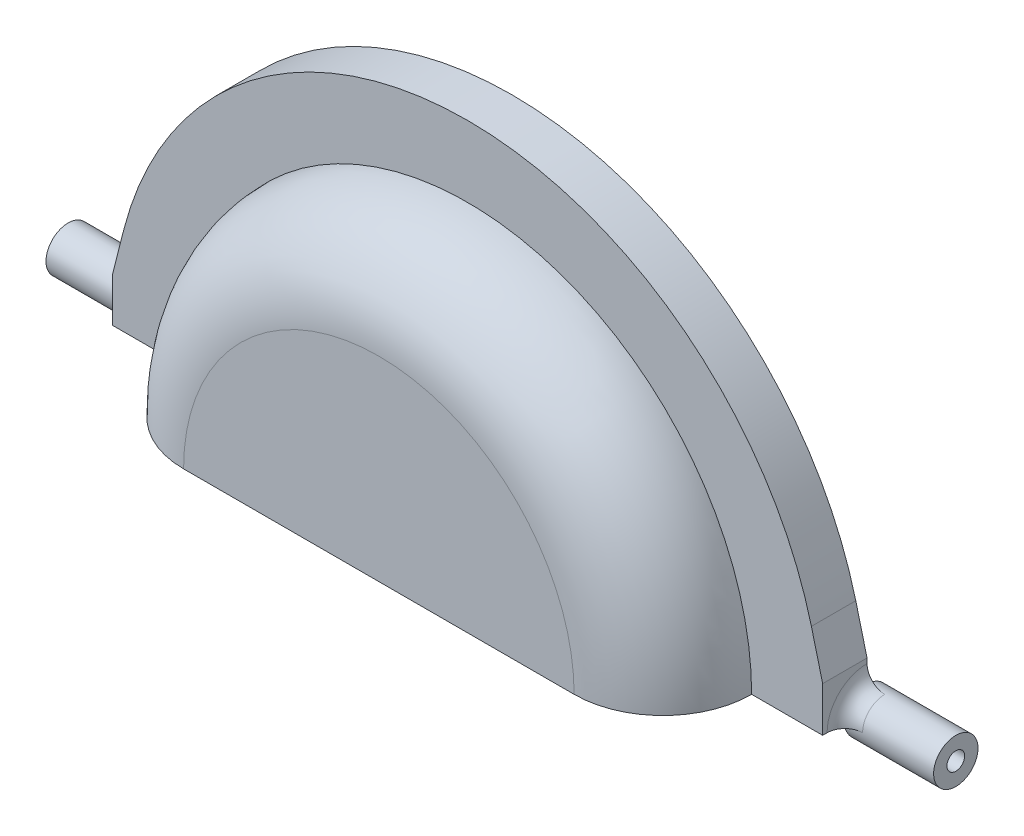
ISO-10303-21;
HEADER;
FILE_DESCRIPTION(('STEP AP214'),'2;1');
FILE_NAME('part.step','',(''),(''),'','','');
FILE_SCHEMA(('AUTOMOTIVE_DESIGN { 1 0 10303 214 1 1 1 1 }'));
ENDSEC;
DATA;
#1=APPLICATION_CONTEXT('core data for automotive mechanical design processes');
#2=APPLICATION_PROTOCOL_DEFINITION('international standard','automotive_design',2000,#1);
#3=PRODUCT_CONTEXT('',#1,'mechanical');
#4=PRODUCT('Part','Part','',(#3));
#5=PRODUCT_RELATED_PRODUCT_CATEGORY('part','',(#4));
#6=PRODUCT_DEFINITION_FORMATION('','',#4);
#7=PRODUCT_DEFINITION_CONTEXT('part definition',#1,'design');
#8=PRODUCT_DEFINITION('design','',#6,#7);
#9=PRODUCT_DEFINITION_SHAPE('','',#8);
#10=(LENGTH_UNIT() NAMED_UNIT(*) SI_UNIT(.MILLI.,.METRE.));
#11=(NAMED_UNIT(*) PLANE_ANGLE_UNIT() SI_UNIT($,.RADIAN.));
#12=(NAMED_UNIT(*) SI_UNIT($,.STERADIAN.) SOLID_ANGLE_UNIT());
#13=UNCERTAINTY_MEASURE_WITH_UNIT(LENGTH_MEASURE(1.E-05),#10,'distance_accuracy_value','');
#14=(GEOMETRIC_REPRESENTATION_CONTEXT(3) GLOBAL_UNCERTAINTY_ASSIGNED_CONTEXT((#13)) GLOBAL_UNIT_ASSIGNED_CONTEXT((#10,
#11,#12)) REPRESENTATION_CONTEXT('',''));
#15=CARTESIAN_POINT('',(0.,0.,0.));
#16=DIRECTION('',(0.,0.,1.));
#17=DIRECTION('',(1.,0.,0.));
#18=AXIS2_PLACEMENT_3D('',#15,#16,#17);
#19=CARTESIAN_POINT('',(0.,0.,5.));
#20=DIRECTION('',(0.,0.,-1.));
#21=DIRECTION('',(-1.,0.,0.));
#22=AXIS2_PLACEMENT_3D('',#19,#20,#21);
#23=PLANE('',#22);
#24=DIRECTION('',(0.248542922989455,-0.968620883231339,0.));
#25=VECTOR('',#24,1.);
#26=CARTESIAN_POINT('',(38.7447914752641,9.94170566687973,5.));
#27=LINE('',#26,#25);
#28=CARTESIAN_POINT('',(38.7298334620742,10.,5.));
#29=VERTEX_POINT('',#28);
#30=CARTESIAN_POINT('',(40.,5.04991001546718,5.));
#31=VERTEX_POINT('',#30);
#32=EDGE_CURVE('E299',#29,#31,#27,.T.);
#33=ORIENTED_EDGE('',*,*,#32,.F.);
#34=CARTESIAN_POINT('',(0.,0.,5.));
#35=DIRECTION('',(0.,0.,-1.));
#36=DIRECTION('',(-1.,0.,0.));
#37=AXIS2_PLACEMENT_3D('',#34,#35,#36);
#38=CIRCLE('',#37,40.);
#39=CARTESIAN_POINT('',(-38.7298334620742,10.,5.));
#40=VERTEX_POINT('',#39);
#41=EDGE_CURVE('E343',#40,#29,#38,.T.);
#42=ORIENTED_EDGE('',*,*,#41,.F.);
#43=DIRECTION('',(-0.246213076315086,-0.969215724723584,0.));
#44=VECTOR('',#43,1.);
#45=CARTESIAN_POINT('',(-38.7683327680442,9.84844780262866,5.));
#46=LINE('',#45,#44);
#47=CARTESIAN_POINT('',(-40.,5.,5.));
#48=VERTEX_POINT('',#47);
#49=EDGE_CURVE('E313',#40,#48,#46,.T.);
#50=ORIENTED_EDGE('',*,*,#49,.T.);
#51=DIRECTION('',(0.,1.,0.));
#52=VECTOR('',#51,1.);
#53=CARTESIAN_POINT('',(-40.,-5.,5.));
#54=LINE('',#53,#52);
#55=CARTESIAN_POINT('',(-40.,0.,5.));
#56=VERTEX_POINT('',#55);
#57=EDGE_CURVE('E353',#56,#48,#54,.T.);
#58=ORIENTED_EDGE('',*,*,#57,.F.);
#59=DIRECTION('',(-1.,0.,0.));
#60=VECTOR('',#59,1.);
#61=CARTESIAN_POINT('',(0.,0.,5.));
#62=LINE('',#61,#60);
#63=CARTESIAN_POINT('',(-32.,0.,5.));
#64=VERTEX_POINT('',#63);
#65=EDGE_CURVE('E370',#64,#56,#62,.T.);
#66=ORIENTED_EDGE('',*,*,#65,.F.);
#67=CARTESIAN_POINT('',(0.,0.,5.));
#68=DIRECTION('',(0.,0.,1.));
#69=DIRECTION('',(1.,0.,0.));
#70=AXIS2_PLACEMENT_3D('',#67,#68,#69);
#71=CIRCLE('',#70,32.);
#72=CARTESIAN_POINT('',(32.,0.,5.));
#73=VERTEX_POINT('',#72);
#74=EDGE_CURVE('E357',#64,#73,#71,.F.);
#75=ORIENTED_EDGE('',*,*,#74,.T.);
#76=CARTESIAN_POINT('',(40.,0.,5.));
#77=VERTEX_POINT('',#76);
#78=EDGE_CURVE('E367',#77,#73,#62,.T.);
#79=ORIENTED_EDGE('',*,*,#78,.F.);
#80=DIRECTION('',(0.,1.,0.));
#81=VECTOR('',#80,1.);
#82=CARTESIAN_POINT('',(40.,-4.95008998453282,5.));
#83=LINE('',#82,#81);
#84=EDGE_CURVE('E291',#77,#31,#83,.T.);
#85=ORIENTED_EDGE('',*,*,#84,.T.);
#86=EDGE_LOOP('',(#33,#42,#50,#58,#66,#75,#79,#85));
#87=FACE_BOUND('',#86,.T.);
#88=ADVANCED_FACE('F118',(#87),#23,.F.);
#89=CARTESIAN_POINT('',(0.,0.,0.));
#90=DIRECTION('',(0.,0.,1.));
#91=DIRECTION('',(1.,0.,0.));
#92=AXIS2_PLACEMENT_3D('',#89,#90,#91);
#93=PLANE('',#92);
#94=DIRECTION('',(0.248542922989455,-0.968620883231338,0.));
#95=VECTOR('',#94,1.);
#96=CARTESIAN_POINT('',(38.7298334620742,10.,0.));
#97=LINE('',#96,#95);
#98=CARTESIAN_POINT('',(38.7298334620742,10.,0.));
#99=VERTEX_POINT('',#98);
#100=CARTESIAN_POINT('',(40.,5.04991001546718,0.));
#101=VERTEX_POINT('',#100);
#102=EDGE_CURVE('E296',#99,#101,#97,.T.);
#103=ORIENTED_EDGE('',*,*,#102,.T.);
#104=DIRECTION('',(0.,1.,0.));
#105=VECTOR('',#104,1.);
#106=CARTESIAN_POINT('',(40.,-4.95008998453282,0.));
#107=LINE('',#106,#105);
#108=CARTESIAN_POINT('',(40.,4.5,0.));
#109=VERTEX_POINT('',#108);
#110=EDGE_CURVE('E279',#109,#101,#107,.T.);
#111=ORIENTED_EDGE('',*,*,#110,.F.);
#112=CARTESIAN_POINT('',(42.,4.5,0.));
#113=DIRECTION('',(0.,0.,1.));
#114=DIRECTION('',(1.,0.,0.));
#115=AXIS2_PLACEMENT_3D('',#112,#113,#114);
#116=CIRCLE('',#115,2.);
#117=CARTESIAN_POINT('',(42.,2.5,0.));
#118=VERTEX_POINT('',#117);
#119=EDGE_CURVE('E438',#109,#118,#116,.T.);
#120=ORIENTED_EDGE('',*,*,#119,.T.);
#121=DIRECTION('',(-1.,0.,0.));
#122=VECTOR('',#121,1.);
#123=CARTESIAN_POINT('',(40.,2.5,0.));
#124=LINE('',#123,#122);
#125=CARTESIAN_POINT('',(40.,2.5,0.));
#126=VERTEX_POINT('',#125);
#127=EDGE_CURVE('E417',#126,#118,#124,.F.);
#128=ORIENTED_EDGE('',*,*,#127,.F.);
#129=CARTESIAN_POINT('',(40.,1.,0.));
#130=VERTEX_POINT('',#129);
#131=EDGE_CURVE('E290',#130,#126,#107,.T.);
#132=ORIENTED_EDGE('',*,*,#131,.F.);
#133=CARTESIAN_POINT('',(40.,0.,0.));
#134=VERTEX_POINT('',#133);
#135=EDGE_CURVE('E293',#134,#130,#107,.T.);
#136=ORIENTED_EDGE('',*,*,#135,.F.);
#137=DIRECTION('',(1.,0.,0.));
#138=VECTOR('',#137,1.);
#139=CARTESIAN_POINT('',(0.,0.,0.));
#140=LINE('',#139,#138);
#141=CARTESIAN_POINT('',(29.,0.,0.));
#142=VERTEX_POINT('',#141);
#143=EDGE_CURVE('E378',#142,#134,#140,.T.);
#144=ORIENTED_EDGE('',*,*,#143,.F.);
#145=CARTESIAN_POINT('',(0.,0.,0.));
#146=DIRECTION('',(0.,0.,-1.));
#147=DIRECTION('',(-1.,0.,0.));
#148=AXIS2_PLACEMENT_3D('',#145,#146,#147);
#149=CIRCLE('',#148,29.);
#150=CARTESIAN_POINT('',(-29.,0.,0.));
#151=VERTEX_POINT('',#150);
#152=EDGE_CURVE('E415',#151,#142,#149,.T.);
#153=ORIENTED_EDGE('',*,*,#152,.F.);
#154=CARTESIAN_POINT('',(-40.,0.,0.));
#155=VERTEX_POINT('',#154);
#156=EDGE_CURVE('E375',#155,#151,#140,.T.);
#157=ORIENTED_EDGE('',*,*,#156,.F.);
#158=DIRECTION('',(0.,1.,0.));
#159=VECTOR('',#158,1.);
#160=CARTESIAN_POINT('',(-40.,-5.,0.));
#161=LINE('',#160,#159);
#162=CARTESIAN_POINT('',(-40.,1.,0.));
#163=VERTEX_POINT('',#162);
#164=EDGE_CURVE('E409',#155,#163,#161,.T.);
#165=ORIENTED_EDGE('',*,*,#164,.T.);
#166=CARTESIAN_POINT('',(-40.,2.5,0.));
#167=VERTEX_POINT('',#166);
#168=EDGE_CURVE('E413',#163,#167,#161,.T.);
#169=ORIENTED_EDGE('',*,*,#168,.T.);
#170=DIRECTION('',(1.,0.,0.));
#171=VECTOR('',#170,1.);
#172=CARTESIAN_POINT('',(-42.,2.5,0.));
#173=LINE('',#172,#171);
#174=CARTESIAN_POINT('',(-42.,2.5,0.));
#175=VERTEX_POINT('',#174);
#176=EDGE_CURVE('E432',#175,#167,#173,.T.);
#177=ORIENTED_EDGE('',*,*,#176,.F.);
#178=CARTESIAN_POINT('',(-42.,4.5,0.));
#179=DIRECTION('',(0.,0.,1.));
#180=DIRECTION('',(1.,0.,0.));
#181=AXIS2_PLACEMENT_3D('',#178,#179,#180);
#182=CIRCLE('',#181,2.);
#183=CARTESIAN_POINT('',(-40.,4.5,0.));
#184=VERTEX_POINT('',#183);
#185=EDGE_CURVE('E440',#175,#184,#182,.T.);
#186=ORIENTED_EDGE('',*,*,#185,.T.);
#187=CARTESIAN_POINT('',(-40.,5.,0.));
#188=VERTEX_POINT('',#187);
#189=EDGE_CURVE('E408',#184,#188,#161,.T.);
#190=ORIENTED_EDGE('',*,*,#189,.T.);
#191=DIRECTION('',(-0.246213076315086,-0.969215724723584,0.));
#192=VECTOR('',#191,1.);
#193=CARTESIAN_POINT('',(-38.7298334620742,10.,0.));
#194=LINE('',#193,#192);
#195=CARTESIAN_POINT('',(-38.7298334620742,10.,0.));
#196=VERTEX_POINT('',#195);
#197=EDGE_CURVE('E308',#196,#188,#194,.T.);
#198=ORIENTED_EDGE('',*,*,#197,.F.);
#199=CARTESIAN_POINT('',(0.,0.,0.));
#200=DIRECTION('',(0.,0.,-1.));
#201=DIRECTION('',(-1.,0.,0.));
#202=AXIS2_PLACEMENT_3D('',#199,#200,#201);
#203=CIRCLE('',#202,40.);
#204=EDGE_CURVE('E301',#196,#99,#203,.T.);
#205=ORIENTED_EDGE('',*,*,#204,.T.);
#206=EDGE_LOOP('',(#103,#111,#120,#128,#132,#136,#144,#153,#157,#165,#169,#177,#186,#190,#198,#205));
#207=FACE_BOUND('',#206,.T.);
#208=ADVANCED_FACE('F304',(#207),#93,.F.);
#209=CARTESIAN_POINT('',(-40.,-5.,5.));
#210=DIRECTION('',(-1.,0.,0.));
#211=DIRECTION('',(0.,0.,1.));
#212=AXIS2_PLACEMENT_3D('',#209,#210,#211);
#213=PLANE('',#212);
#214=ORIENTED_EDGE('',*,*,#189,.F.);
#215=CARTESIAN_POINT('',(-40.,0.,0.));
#216=DIRECTION('',(-1.,0.,0.));
#217=DIRECTION('',(0.,0.,1.));
#218=AXIS2_PLACEMENT_3D('',#215,#216,#217);
#219=CIRCLE('',#218,4.5);
#220=CARTESIAN_POINT('',(-40.,0.,4.5));
#221=VERTEX_POINT('',#220);
#222=EDGE_CURVE('E434',#184,#221,#219,.F.);
#223=ORIENTED_EDGE('',*,*,#222,.T.);
#224=DIRECTION('',(0.,0.,1.));
#225=VECTOR('',#224,1.);
#226=CARTESIAN_POINT('',(-40.,0.,5.));
#227=LINE('',#226,#225);
#228=EDGE_CURVE('E358',#221,#56,#227,.T.);
#229=ORIENTED_EDGE('',*,*,#228,.T.);
#230=ORIENTED_EDGE('',*,*,#57,.T.);
#231=DIRECTION('',(0.,0.,-1.));
#232=VECTOR('',#231,1.);
#233=CARTESIAN_POINT('',(-40.,5.,5.));
#234=LINE('',#233,#232);
#235=EDGE_CURVE('E350',#48,#188,#234,.T.);
#236=ORIENTED_EDGE('',*,*,#235,.T.);
#237=EDGE_LOOP('',(#214,#223,#229,#230,#236));
#238=FACE_BOUND('',#237,.T.);
#239=ADVANCED_FACE('F498',(#238),#213,.T.);
#240=CARTESIAN_POINT('',(40.,-4.95008998453282,5.));
#241=DIRECTION('',(-1.,0.,0.));
#242=DIRECTION('',(0.,0.,1.));
#243=AXIS2_PLACEMENT_3D('',#240,#241,#242);
#244=PLANE('',#243);
#245=DIRECTION('',(0.,0.,1.));
#246=VECTOR('',#245,1.);
#247=CARTESIAN_POINT('',(40.,0.,5.));
#248=LINE('',#247,#246);
#249=CARTESIAN_POINT('',(40.,0.,4.5));
#250=VERTEX_POINT('',#249);
#251=EDGE_CURVE('E374',#250,#77,#248,.T.);
#252=ORIENTED_EDGE('',*,*,#251,.F.);
#253=CARTESIAN_POINT('',(40.,0.,0.));
#254=DIRECTION('',(-1.,0.,0.));
#255=DIRECTION('',(0.,0.,1.));
#256=AXIS2_PLACEMENT_3D('',#253,#254,#255);
#257=CIRCLE('',#256,4.5);
#258=EDGE_CURVE('E286',#250,#109,#257,.T.);
#259=ORIENTED_EDGE('',*,*,#258,.T.);
#260=ORIENTED_EDGE('',*,*,#110,.T.);
#261=DIRECTION('',(0.,0.,-1.));
#262=VECTOR('',#261,1.);
#263=CARTESIAN_POINT('',(40.,5.04991001546718,5.));
#264=LINE('',#263,#262);
#265=EDGE_CURVE('E284',#31,#101,#264,.T.);
#266=ORIENTED_EDGE('',*,*,#265,.F.);
#267=ORIENTED_EDGE('',*,*,#84,.F.);
#268=EDGE_LOOP('',(#252,#259,#260,#266,#267));
#269=FACE_BOUND('',#268,.T.);
#270=ADVANCED_FACE('F282',(#269),#244,.F.);
#271=CARTESIAN_POINT('',(60.,0.,15.01));
#272=DIRECTION('',(0.,-1.,0.));
#273=DIRECTION('',(0.,0.,-1.));
#274=AXIS2_PLACEMENT_3D('',#271,#272,#273);
#275=PLANE('',#274);
#276=DIRECTION('',(0.,0.,-1.));
#277=VECTOR('',#276,1.);
#278=CARTESIAN_POINT('',(-39.,0.,15.01));
#279=LINE('',#278,#277);
#280=CARTESIAN_POINT('',(-39.,0.,2.5));
#281=VERTEX_POINT('',#280);
#282=CARTESIAN_POINT('',(-39.,0.,1.));
#283=VERTEX_POINT('',#282);
#284=EDGE_CURVE('E549',#281,#283,#279,.T.);
#285=ORIENTED_EDGE('',*,*,#284,.T.);
#286=DIRECTION('',(1.,0.,0.));
#287=VECTOR('',#286,1.);
#288=CARTESIAN_POINT('',(-39.,0.,1.));
#289=LINE('',#288,#287);
#290=CARTESIAN_POINT('',(-40.,0.,1.));
#291=VERTEX_POINT('',#290);
#292=EDGE_CURVE('E551',#283,#291,#289,.F.);
#293=ORIENTED_EDGE('',*,*,#292,.T.);
#294=EDGE_CURVE('E354',#155,#291,#227,.T.);
#295=ORIENTED_EDGE('',*,*,#294,.F.);
#296=ORIENTED_EDGE('',*,*,#156,.T.);
#297=DIRECTION('',(0.,0.,-1.));
#298=VECTOR('',#297,1.);
#299=CARTESIAN_POINT('',(-29.,0.,5.));
#300=LINE('',#299,#298);
#301=CARTESIAN_POINT('',(-29.,0.,5.));
#302=VERTEX_POINT('',#301);
#303=EDGE_CURVE('E379',#151,#302,#300,.F.);
#304=ORIENTED_EDGE('',*,*,#303,.T.);
#305=DIRECTION('',(-1.,0.,0.));
#306=VECTOR('',#305,1.);
#307=CARTESIAN_POINT('',(0.,0.,5.));
#308=LINE('',#307,#306);
#309=CARTESIAN_POINT('',(-30.,0.,5.));
#310=VERTEX_POINT('',#309);
#311=EDGE_CURVE('E339',#302,#310,#308,.T.);
#312=ORIENTED_EDGE('',*,*,#311,.T.);
#313=CARTESIAN_POINT('',(-22.,0.,5.));
#314=DIRECTION('',(0.,-1.,0.));
#315=DIRECTION('',(0.,0.,-1.));
#316=AXIS2_PLACEMENT_3D('',#313,#314,#315);
#317=CIRCLE('',#316,8.);
#318=CARTESIAN_POINT('',(-22.,0.,13.));
#319=VERTEX_POINT('',#318);
#320=EDGE_CURVE('E391',#310,#319,#317,.F.);
#321=ORIENTED_EDGE('',*,*,#320,.T.);
#322=DIRECTION('',(1.,0.,0.));
#323=VECTOR('',#322,1.);
#324=CARTESIAN_POINT('',(0.,0.,13.));
#325=LINE('',#324,#323);
#326=CARTESIAN_POINT('',(22.,0.,13.));
#327=VERTEX_POINT('',#326);
#328=EDGE_CURVE('E385',#319,#327,#325,.T.);
#329=ORIENTED_EDGE('',*,*,#328,.T.);
#330=CARTESIAN_POINT('',(22.,0.,5.));
#331=DIRECTION('',(0.,-1.,0.));
#332=DIRECTION('',(0.,0.,-1.));
#333=AXIS2_PLACEMENT_3D('',#330,#331,#332);
#334=CIRCLE('',#333,8.);
#335=CARTESIAN_POINT('',(30.,0.,5.));
#336=VERTEX_POINT('',#335);
#337=EDGE_CURVE('E388',#327,#336,#334,.F.);
#338=ORIENTED_EDGE('',*,*,#337,.T.);
#339=CARTESIAN_POINT('',(29.,0.,5.));
#340=VERTEX_POINT('',#339);
#341=EDGE_CURVE('E394',#336,#340,#308,.T.);
#342=ORIENTED_EDGE('',*,*,#341,.T.);
#343=DIRECTION('',(0.,0.,-1.));
#344=VECTOR('',#343,1.);
#345=CARTESIAN_POINT('',(29.,0.,5.));
#346=LINE('',#345,#344);
#347=EDGE_CURVE('E382',#340,#142,#346,.T.);
#348=ORIENTED_EDGE('',*,*,#347,.T.);
#349=ORIENTED_EDGE('',*,*,#143,.T.);
#350=CARTESIAN_POINT('',(40.,0.,1.));
#351=VERTEX_POINT('',#350);
#352=EDGE_CURVE('E371',#134,#351,#248,.T.);
#353=ORIENTED_EDGE('',*,*,#352,.T.);
#354=DIRECTION('',(-1.,0.,0.));
#355=VECTOR('',#354,1.);
#356=CARTESIAN_POINT('',(40.,0.,1.));
#357=LINE('',#356,#355);
#358=CARTESIAN_POINT('',(39.,0.,1.));
#359=VERTEX_POINT('',#358);
#360=EDGE_CURVE('E444',#351,#359,#357,.T.);
#361=ORIENTED_EDGE('',*,*,#360,.T.);
#362=DIRECTION('',(0.,0.,1.));
#363=VECTOR('',#362,1.);
#364=CARTESIAN_POINT('',(39.,0.,15.01));
#365=LINE('',#364,#363);
#366=CARTESIAN_POINT('',(39.,0.,2.5));
#367=VERTEX_POINT('',#366);
#368=EDGE_CURVE('E447',#359,#367,#365,.T.);
#369=ORIENTED_EDGE('',*,*,#368,.T.);
#370=DIRECTION('',(-1.,0.,0.));
#371=VECTOR('',#370,1.);
#372=CARTESIAN_POINT('',(42.,0.,2.5));
#373=LINE('',#372,#371);
#374=CARTESIAN_POINT('',(42.,0.,2.5));
#375=VERTEX_POINT('',#374);
#376=EDGE_CURVE('E423',#375,#367,#373,.T.);
#377=ORIENTED_EDGE('',*,*,#376,.F.);
#378=CARTESIAN_POINT('',(42.,0.,4.5));
#379=DIRECTION('',(0.,-1.,0.));
#380=DIRECTION('',(0.,0.,-1.));
#381=AXIS2_PLACEMENT_3D('',#378,#379,#380);
#382=CIRCLE('',#381,2.);
#383=EDGE_CURVE('E436',#375,#250,#382,.F.);
#384=ORIENTED_EDGE('',*,*,#383,.T.);
#385=ORIENTED_EDGE('',*,*,#251,.T.);
#386=ORIENTED_EDGE('',*,*,#78,.T.);
#387=CARTESIAN_POINT('',(22.,0.,5.));
#388=DIRECTION('',(0.,-1.,0.));
#389=DIRECTION('',(0.,0.,-1.));
#390=AXIS2_PLACEMENT_3D('',#387,#388,#389);
#391=CIRCLE('',#390,10.);
#392=CARTESIAN_POINT('',(22.,0.,15.));
#393=VERTEX_POINT('',#392);
#394=EDGE_CURVE('E361',#393,#73,#391,.F.);
#395=ORIENTED_EDGE('',*,*,#394,.F.);
#396=DIRECTION('',(1.,0.,0.));
#397=VECTOR('',#396,1.);
#398=CARTESIAN_POINT('',(0.,0.,15.));
#399=LINE('',#398,#397);
#400=CARTESIAN_POINT('',(-22.,0.,15.));
#401=VERTEX_POINT('',#400);
#402=EDGE_CURVE('E364',#401,#393,#399,.T.);
#403=ORIENTED_EDGE('',*,*,#402,.F.);
#404=CARTESIAN_POINT('',(-22.,0.,5.));
#405=DIRECTION('',(0.,-1.,0.));
#406=DIRECTION('',(0.,0.,-1.));
#407=AXIS2_PLACEMENT_3D('',#404,#405,#406);
#408=CIRCLE('',#407,10.);
#409=EDGE_CURVE('E359',#64,#401,#408,.F.);
#410=ORIENTED_EDGE('',*,*,#409,.F.);
#411=ORIENTED_EDGE('',*,*,#65,.T.);
#412=ORIENTED_EDGE('',*,*,#228,.F.);
#413=CARTESIAN_POINT('',(-42.,0.,4.5));
#414=DIRECTION('',(0.,-1.,0.));
#415=DIRECTION('',(0.,0.,-1.));
#416=AXIS2_PLACEMENT_3D('',#413,#414,#415);
#417=CIRCLE('',#416,2.);
#418=CARTESIAN_POINT('',(-42.,0.,2.5));
#419=VERTEX_POINT('',#418);
#420=EDGE_CURVE('E442',#221,#419,#417,.F.);
#421=ORIENTED_EDGE('',*,*,#420,.T.);
#422=DIRECTION('',(1.,0.,0.));
#423=VECTOR('',#422,1.);
#424=CARTESIAN_POINT('',(-40.,0.,2.5));
#425=LINE('',#424,#423);
#426=EDGE_CURVE('E426',#281,#419,#425,.F.);
#427=ORIENTED_EDGE('',*,*,#426,.F.);
#428=EDGE_LOOP('',(#285,#293,#295,#296,#304,#312,#321,#329,#338,#342,#348,#349,#353,#361,#369,
#377,#384,#385,#386,#395,#403,#410,#411,#412,#421,#427));
#429=FACE_BOUND('',#428,.T.);
#430=ADVANCED_FACE('F516',(#429),#275,.T.);
#431=CARTESIAN_POINT('',(0.,0.,15.));
#432=DIRECTION('',(0.,0.,1.));
#433=DIRECTION('',(1.,0.,0.));
#434=AXIS2_PLACEMENT_3D('',#431,#432,#433);
#435=PLANE('',#434);
#436=CARTESIAN_POINT('',(0.,0.,15.));
#437=DIRECTION('',(0.,0.,1.));
#438=DIRECTION('',(1.,0.,0.));
#439=AXIS2_PLACEMENT_3D('',#436,#437,#438);
#440=CIRCLE('',#439,22.);
#441=EDGE_CURVE('E398',#393,#401,#440,.T.);
#442=ORIENTED_EDGE('',*,*,#441,.T.);
#443=ORIENTED_EDGE('',*,*,#402,.T.);
#444=EDGE_LOOP('',(#442,#443));
#445=FACE_BOUND('',#444,.T.);
#446=ADVANCED_FACE('F512',(#445),#435,.T.);
#447=CARTESIAN_POINT('',(0.,0.,5.));
#448=DIRECTION('',(0.,0.,1.));
#449=DIRECTION('',(1.,0.,0.));
#450=AXIS2_PLACEMENT_3D('',#447,#448,#449);
#451=TOROIDAL_SURFACE('',#450,22.,10.);
#452=ORIENTED_EDGE('',*,*,#441,.F.);
#453=ORIENTED_EDGE('',*,*,#394,.T.);
#454=ORIENTED_EDGE('',*,*,#74,.F.);
#455=ORIENTED_EDGE('',*,*,#409,.T.);
#456=EDGE_LOOP('',(#452,#453,#454,#455));
#457=FACE_BOUND('',#456,.T.);
#458=ADVANCED_FACE('F505',(#457),#451,.T.);
#459=ORIENTED_EDGE('',*,*,#135,.T.);
#460=CARTESIAN_POINT('',(40.,0.,0.));
#461=DIRECTION('',(1.,0.,0.));
#462=DIRECTION('',(0.,0.,-1.));
#463=AXIS2_PLACEMENT_3D('',#460,#461,#462);
#464=CIRCLE('',#463,1.);
#465=EDGE_CURVE('E333',#130,#351,#464,.T.);
#466=ORIENTED_EDGE('',*,*,#465,.T.);
#467=ORIENTED_EDGE('',*,*,#352,.F.);
#468=EDGE_LOOP('',(#459,#466,#467));
#469=FACE_BOUND('',#468,.T.);
#470=ADVANCED_FACE('F501',(#469),#244,.F.);
#471=CARTESIAN_POINT('',(-40.,0.,0.));
#472=DIRECTION('',(-1.,0.,0.));
#473=DIRECTION('',(0.,0.,1.));
#474=AXIS2_PLACEMENT_3D('',#471,#472,#473);
#475=CIRCLE('',#474,1.);
#476=EDGE_CURVE('E321',#291,#163,#475,.T.);
#477=ORIENTED_EDGE('',*,*,#476,.T.);
#478=ORIENTED_EDGE('',*,*,#164,.F.);
#479=ORIENTED_EDGE('',*,*,#294,.T.);
#480=EDGE_LOOP('',(#477,#478,#479));
#481=FACE_BOUND('',#480,.T.);
#482=ADVANCED_FACE('F491',(#481),#213,.T.);
#483=CARTESIAN_POINT('',(0.,0.,5.));
#484=DIRECTION('',(0.,0.,-1.));
#485=DIRECTION('',(-1.,0.,0.));
#486=AXIS2_PLACEMENT_3D('',#483,#484,#485);
#487=CYLINDRICAL_SURFACE('',#486,29.);
#488=ORIENTED_EDGE('',*,*,#303,.F.);
#489=ORIENTED_EDGE('',*,*,#152,.T.);
#490=ORIENTED_EDGE('',*,*,#347,.F.);
#491=CARTESIAN_POINT('',(0.,0.,5.));
#492=DIRECTION('',(0.,0.,-1.));
#493=DIRECTION('',(-1.,0.,0.));
#494=AXIS2_PLACEMENT_3D('',#491,#492,#493);
#495=CIRCLE('',#494,29.);
#496=EDGE_CURVE('E412',#302,#340,#495,.T.);
#497=ORIENTED_EDGE('',*,*,#496,.F.);
#498=EDGE_LOOP('',(#488,#489,#490,#497));
#499=FACE_BOUND('',#498,.T.);
#500=ADVANCED_FACE('F488',(#499),#487,.F.);
#501=CARTESIAN_POINT('',(0.,0.,13.));
#502=DIRECTION('',(0.,0.,1.));
#503=DIRECTION('',(1.,0.,0.));
#504=AXIS2_PLACEMENT_3D('',#501,#502,#503);
#505=PLANE('',#504);
#506=ORIENTED_EDGE('',*,*,#328,.F.);
#507=CARTESIAN_POINT('',(0.,0.,13.));
#508=DIRECTION('',(0.,0.,1.));
#509=DIRECTION('',(1.,0.,0.));
#510=AXIS2_PLACEMENT_3D('',#507,#508,#509);
#511=CIRCLE('',#510,22.);
#512=EDGE_CURVE('E401',#327,#319,#511,.T.);
#513=ORIENTED_EDGE('',*,*,#512,.F.);
#514=EDGE_LOOP('',(#506,#513));
#515=FACE_BOUND('',#514,.T.);
#516=ADVANCED_FACE('F486',(#515),#505,.F.);
#517=CARTESIAN_POINT('',(0.,0.,5.));
#518=DIRECTION('',(0.,0.,1.));
#519=DIRECTION('',(1.,0.,0.));
#520=AXIS2_PLACEMENT_3D('',#517,#518,#519);
#521=TOROIDAL_SURFACE('',#520,22.,8.);
#522=ORIENTED_EDGE('',*,*,#337,.F.);
#523=ORIENTED_EDGE('',*,*,#512,.T.);
#524=ORIENTED_EDGE('',*,*,#320,.F.);
#525=CARTESIAN_POINT('',(0.,0.,5.));
#526=DIRECTION('',(0.,0.,-1.));
#527=DIRECTION('',(-1.,0.,0.));
#528=AXIS2_PLACEMENT_3D('',#525,#526,#527);
#529=CIRCLE('',#528,30.);
#530=EDGE_CURVE('E346',#336,#310,#529,.F.);
#531=ORIENTED_EDGE('',*,*,#530,.F.);
#532=EDGE_LOOP('',(#522,#523,#524,#531));
#533=FACE_BOUND('',#532,.T.);
#534=ADVANCED_FACE('F482',(#533),#521,.F.);
#535=ORIENTED_EDGE('',*,*,#341,.F.);
#536=ORIENTED_EDGE('',*,*,#530,.T.);
#537=ORIENTED_EDGE('',*,*,#311,.F.);
#538=ORIENTED_EDGE('',*,*,#496,.T.);
#539=EDGE_LOOP('',(#535,#536,#537,#538));
#540=FACE_BOUND('',#539,.T.);
#541=ADVANCED_FACE('F485',(#540),#23,.F.);
#542=CARTESIAN_POINT('',(0.,0.,5.));
#543=DIRECTION('',(0.,0.,-1.));
#544=DIRECTION('',(-1.,0.,0.));
#545=AXIS2_PLACEMENT_3D('',#542,#543,#544);
#546=CYLINDRICAL_SURFACE('',#545,40.);
#547=ORIENTED_EDGE('',*,*,#204,.F.);
#548=DIRECTION('',(0.,0.,-1.));
#549=VECTOR('',#548,1.);
#550=CARTESIAN_POINT('',(-38.7298334620742,10.,5.));
#551=LINE('',#550,#549);
#552=EDGE_CURVE('E341',#40,#196,#551,.T.);
#553=ORIENTED_EDGE('',*,*,#552,.F.);
#554=ORIENTED_EDGE('',*,*,#41,.T.);
#555=DIRECTION('',(0.,0.,-1.));
#556=VECTOR('',#555,1.);
#557=CARTESIAN_POINT('',(38.7298334620742,10.,5.));
#558=LINE('',#557,#556);
#559=EDGE_CURVE('E344',#29,#99,#558,.T.);
#560=ORIENTED_EDGE('',*,*,#559,.T.);
#561=EDGE_LOOP('',(#547,#553,#554,#560));
#562=FACE_BOUND('',#561,.T.);
#563=ADVANCED_FACE('F521',(#562),#546,.T.);
#564=CARTESIAN_POINT('',(50.,0.,0.));
#565=DIRECTION('',(1.,0.,0.));
#566=DIRECTION('',(0.,0.,-1.));
#567=AXIS2_PLACEMENT_3D('',#564,#565,#566);
#568=PLANE('',#567);
#569=CARTESIAN_POINT('',(50.,0.,0.));
#570=DIRECTION('',(1.,0.,0.));
#571=DIRECTION('',(0.,0.,-1.));
#572=AXIS2_PLACEMENT_3D('',#569,#570,#571);
#573=CIRCLE('',#572,2.5);
#574=CARTESIAN_POINT('',(50.,0.,-2.5));
#575=VERTEX_POINT('',#574);
#576=EDGE_CURVE('E336',#575,#575,#573,.T.);
#577=ORIENTED_EDGE('',*,*,#576,.T.);
#578=EDGE_LOOP('',(#577));
#579=FACE_BOUND('',#578,.T.);
#580=CARTESIAN_POINT('',(50.,0.,0.));
#581=DIRECTION('',(1.,0.,0.));
#582=DIRECTION('',(0.,0.,-1.));
#583=AXIS2_PLACEMENT_3D('',#580,#581,#582);
#584=CIRCLE('',#583,1.);
#585=CARTESIAN_POINT('',(50.,0.,-1.));
#586=VERTEX_POINT('',#585);
#587=EDGE_CURVE('E329',#586,#586,#584,.T.);
#588=ORIENTED_EDGE('',*,*,#587,.F.);
#589=EDGE_LOOP('',(#588));
#590=FACE_BOUND('',#589,.T.);
#591=ADVANCED_FACE('F520',(#579,#590),#568,.T.);
#592=CARTESIAN_POINT('',(40.,0.,0.));
#593=DIRECTION('',(1.,0.,0.));
#594=DIRECTION('',(0.,0.,-1.));
#595=AXIS2_PLACEMENT_3D('',#592,#593,#594);
#596=PLANE('',#595);
#597=CARTESIAN_POINT('',(40.,0.,0.));
#598=DIRECTION('',(1.,0.,0.));
#599=DIRECTION('',(0.,0.,-1.));
#600=AXIS2_PLACEMENT_3D('',#597,#598,#599);
#601=CIRCLE('',#600,2.5);
#602=CARTESIAN_POINT('',(40.,-1.,2.29128784747792));
#603=VERTEX_POINT('',#602);
#604=EDGE_CURVE('E332',#603,#126,#601,.T.);
#605=ORIENTED_EDGE('',*,*,#604,.F.);
#606=DIRECTION('',(0.,0.,1.));
#607=VECTOR('',#606,1.);
#608=CARTESIAN_POINT('',(40.,-1.,0.));
#609=LINE('',#608,#607);
#610=CARTESIAN_POINT('',(40.,-1.,0.));
#611=VERTEX_POINT('',#610);
#612=EDGE_CURVE('E450',#603,#611,#609,.F.);
#613=ORIENTED_EDGE('',*,*,#612,.T.);
#614=EDGE_CURVE('E327',#611,#130,#464,.T.);
#615=ORIENTED_EDGE('',*,*,#614,.T.);
#616=ORIENTED_EDGE('',*,*,#131,.T.);
#617=EDGE_LOOP('',(#605,#613,#615,#616));
#618=FACE_BOUND('',#617,.T.);
#619=ADVANCED_FACE('F528',(#618),#596,.F.);
#620=CARTESIAN_POINT('',(50.,0.,0.));
#621=DIRECTION('',(-1.,0.,0.));
#622=DIRECTION('',(0.,0.,1.));
#623=AXIS2_PLACEMENT_3D('',#620,#621,#622);
#624=CYLINDRICAL_SURFACE('',#623,2.5);
#625=ORIENTED_EDGE('',*,*,#576,.F.);
#626=EDGE_LOOP('',(#625));
#627=FACE_BOUND('',#626,.T.);
#628=CARTESIAN_POINT('',(42.,0.,0.));
#629=DIRECTION('',(-1.,0.,0.));
#630=DIRECTION('',(0.,0.,1.));
#631=AXIS2_PLACEMENT_3D('',#628,#629,#630);
#632=CIRCLE('',#631,2.5);
#633=EDGE_CURVE('E420',#118,#375,#632,.F.);
#634=ORIENTED_EDGE('',*,*,#633,.T.);
#635=ORIENTED_EDGE('',*,*,#376,.T.);
#636=CARTESIAN_POINT('',(39.,0.,2.5));
#637=CARTESIAN_POINT('',(39.0280901230007,-1.92973954300894E-07,2.49999728206757));
#638=CARTESIAN_POINT('',(39.0561668013907,-0.00118432461558776,2.50000030614936));
#639=CARTESIAN_POINT('',(39.1121200625607,-0.00590836912218245,2.49999466336678));
#640=CARTESIAN_POINT('',(39.1399966535459,-0.00944818482107421,2.49998599698458));
#641=CARTESIAN_POINT('',(39.2229944544893,-0.0235703098646449,2.49990777554575));
#642=CARTESIAN_POINT('',(39.2775612522016,-0.0376553721221548,2.4997861170755));
#643=CARTESIAN_POINT('',(39.3835614635944,-0.0747756197294556,2.49894964984844));
#644=CARTESIAN_POINT('',(39.4349930801969,-0.0978158833974804,2.49823450427512));
#645=CARTESIAN_POINT('',(39.5332427891901,-0.152178601713611,2.49551186076275));
#646=CARTESIAN_POINT('',(39.5800616216678,-0.183499724779164,2.49350457052934));
#647=CARTESIAN_POINT('',(39.6674184251146,-0.253236488145046,2.48738506744291));
#648=CARTESIAN_POINT('',(39.7079959114076,-0.291603806257642,2.48328687256288));
#649=CARTESIAN_POINT('',(39.7820337616525,-0.374300404172809,2.47217189410457));
#650=CARTESIAN_POINT('',(39.8154973177894,-0.418626995273757,2.46515642377053));
#651=CARTESIAN_POINT('',(39.8736066950376,-0.510424943572155,2.44777185328984));
#652=CARTESIAN_POINT('',(39.898465047826,-0.557779986349489,2.43749780265057));
#653=CARTESIAN_POINT('',(39.940106521088,-0.65503859512052,2.41317958165235));
#654=CARTESIAN_POINT('',(39.9568858653746,-0.7049433408332,2.39913365305895));
#655=CARTESIAN_POINT('',(39.9798899826753,-0.796063654629034,2.37025604525949));
#656=CARTESIAN_POINT('',(39.9875081311279,-0.837143793185809,2.3560716305209));
#657=CARTESIAN_POINT('',(39.9975675395532,-0.918982152358219,2.325383437206));
#658=CARTESIAN_POINT('',(40.0000189826846,-0.959740848167252,2.30888428940292));
#659=CARTESIAN_POINT('',(40.,-1.,2.29128784747792));
#660=B_SPLINE_CURVE_WITH_KNOTS('',3,(#636,#637,#638,#639,#640,#641,#642,#643,#644,#645,#646,
#647,#648,#649,#650,#651,#652,#653,#654,#655,#656,#657,#658,#659),.UNSPECIFIED.,.F.,.F.,(4,2,2,
2,2,2,2,2,2,2,2,4),(0.,0.0842187103176523,0.168433947039655,0.3366346936024,0.504930962986504,
0.673200186359003,0.840355829276986,1.00743630652759,1.17003304970838,1.33270571818311,
1.46471279557811,1.59645945344693),.UNSPECIFIED.);
#661=EDGE_CURVE('E452',#367,#603,#660,.T.);
#662=ORIENTED_EDGE('',*,*,#661,.T.);
#663=ORIENTED_EDGE('',*,*,#604,.T.);
#664=ORIENTED_EDGE('',*,*,#127,.T.);
#665=EDGE_LOOP('',(#634,#635,#662,#663,#664));
#666=FACE_BOUND('',#665,.T.);
#667=ADVANCED_FACE('F464',(#627,#666),#624,.T.);
#668=CARTESIAN_POINT('',(50.,0.,0.));
#669=DIRECTION('',(-1.,0.,0.));
#670=DIRECTION('',(0.,0.,1.));
#671=AXIS2_PLACEMENT_3D('',#668,#669,#670);
#672=CYLINDRICAL_SURFACE('',#671,1.);
#673=ORIENTED_EDGE('',*,*,#587,.T.);
#674=EDGE_LOOP('',(#673));
#675=FACE_BOUND('',#674,.T.);
#676=ORIENTED_EDGE('',*,*,#465,.F.);
#677=ORIENTED_EDGE('',*,*,#614,.F.);
#678=CARTESIAN_POINT('',(40.,-1.,0.));
#679=CARTESIAN_POINT('',(39.9999915273139,-1.00000255507436,0.0278381927217966));
#680=CARTESIAN_POINT('',(39.99999978463,-0.99883754943608,0.0556750830582132));
#681=CARTESIAN_POINT('',(39.9999880697923,-0.994192246193951,0.111154871525307));
#682=CARTESIAN_POINT('',(39.9999680978103,-0.990711962686048,0.13879777083601));
#683=CARTESIAN_POINT('',(39.999838122104,-0.981447793160794,0.193746811981216));
#684=CARTESIAN_POINT('',(39.9997279600974,-0.975659866432536,0.221052276035566));
#685=CARTESIAN_POINT('',(39.9992948443434,-0.961827514487354,0.275075377644212));
#686=CARTESIAN_POINT('',(39.9989718933492,-0.953783118466748,0.301793022799437));
#687=CARTESIAN_POINT('',(39.9974536894179,-0.926319454541931,0.380838600641397));
#688=CARTESIAN_POINT('',(39.9957090051225,-0.903571386873314,0.432049284767443));
#689=CARTESIAN_POINT('',(39.9890478897459,-0.849973590955637,0.529761514264641));
#690=CARTESIAN_POINT('',(39.9841343606377,-0.819131290575248,0.576267323244673));
#691=CARTESIAN_POINT('',(39.9693336992212,-0.75195765856337,0.661345099804002));
#692=CARTESIAN_POINT('',(39.9596481926507,-0.715887578151217,0.700155897901766));
#693=CARTESIAN_POINT('',(39.9335989981964,-0.639430242927073,0.770596845589716));
#694=CARTESIAN_POINT('',(39.917245590848,-0.599049704393573,0.802237933087642));
#695=CARTESIAN_POINT('',(39.8794734224097,-0.522406348286376,0.853775145902466));
#696=CARTESIAN_POINT('',(39.8590473185644,-0.486331335314379,0.874683779565999));
#697=CARTESIAN_POINT('',(39.8122441705969,-0.415131110475225,0.910635648122498));
#698=CARTESIAN_POINT('',(39.7858668676329,-0.380005939995026,0.925678627816607));
#699=CARTESIAN_POINT('',(39.7293358302535,-0.314556580877717,0.949844403228038));
#700=CARTESIAN_POINT('',(39.6994890903201,-0.284072178866777,0.959259493265596));
#701=CARTESIAN_POINT('',(39.6356188135375,-0.226804963194045,0.974391082137506));
#702=CARTESIAN_POINT('',(39.6015942735558,-0.200023041830343,0.980106690614305));
#703=CARTESIAN_POINT('',(39.5265924301931,-0.148549380966673,0.989285036120624));
#704=CARTESIAN_POINT('',(39.4852603057874,-0.12432611840728,0.992469150951148));
#705=CARTESIAN_POINT('',(39.3994625197932,-0.082000129180366,0.996859751064664));
#706=CARTESIAN_POINT('',(39.354994278958,-0.0639025130841418,0.998064588267326));
#707=CARTESIAN_POINT('',(39.2595676332026,-0.0328546201789263,0.999594228157352));
#708=CARTESIAN_POINT('',(39.2083933218189,-0.0205537282614387,0.999824934203476));
#709=CARTESIAN_POINT('',(39.1307230912508,-0.00823310501942977,0.999973321801789));
#710=CARTESIAN_POINT('',(39.1046769026901,-0.00514801329226907,0.999989824627128));
#711=CARTESIAN_POINT('',(39.0524243977987,-0.00103173866605946,1.00000062836951));
#712=CARTESIAN_POINT('',(39.0262180920361,-4.21652826842797E-07,0.999994930736337));
#713=CARTESIAN_POINT('',(39.,0.,1.));
#714=B_SPLINE_CURVE_WITH_KNOTS('',3,(#678,#679,#680,#681,#682,#683,#684,#685,#686,#687,#688,
#689,#690,#691,#692,#693,#694,#695,#696,#697,#698,#699,#700,#701,#702,#703,#704,#705,#706,#707,
#708,#709,#710,#711,#712,#713),.UNSPECIFIED.,.F.,.F.,(4,2,2,2,2,2,2,2,2,2,2,2,2,2,2,2,2,4),(0.,
0.0834878347281733,0.166975161167902,0.250609321497255,0.334242399739241,0.501538275082881,
0.668681160903593,0.829299803909304,0.989671736729566,1.12821123604275,1.26675676216527,
1.39728229603103,1.52783923192528,1.671304684928,1.81488953652532,1.97206569111011,
2.05068136863726,2.12929191228915),.UNSPECIFIED.);
#715=EDGE_CURVE('E458',#611,#359,#714,.T.);
#716=ORIENTED_EDGE('',*,*,#715,.T.);
#717=ORIENTED_EDGE('',*,*,#360,.F.);
#718=EDGE_LOOP('',(#676,#677,#716,#717));
#719=FACE_BOUND('',#718,.T.);
#720=ADVANCED_FACE('F572',(#675,#719),#672,.F.);
#721=CARTESIAN_POINT('',(-50.,0.,0.));
#722=DIRECTION('',(-1.,0.,0.));
#723=DIRECTION('',(0.,0.,1.));
#724=AXIS2_PLACEMENT_3D('',#721,#722,#723);
#725=PLANE('',#724);
#726=CARTESIAN_POINT('',(-50.,0.,0.));
#727=DIRECTION('',(-1.,0.,0.));
#728=DIRECTION('',(0.,0.,1.));
#729=AXIS2_PLACEMENT_3D('',#726,#727,#728);
#730=CIRCLE('',#729,2.5);
#731=CARTESIAN_POINT('',(-50.,0.,2.5));
#732=VERTEX_POINT('',#731);
#733=EDGE_CURVE('E324',#732,#732,#730,.T.);
#734=ORIENTED_EDGE('',*,*,#733,.T.);
#735=EDGE_LOOP('',(#734));
#736=FACE_BOUND('',#735,.T.);
#737=CARTESIAN_POINT('',(-50.,0.,0.));
#738=DIRECTION('',(-1.,0.,0.));
#739=DIRECTION('',(0.,0.,1.));
#740=AXIS2_PLACEMENT_3D('',#737,#738,#739);
#741=CIRCLE('',#740,1.);
#742=CARTESIAN_POINT('',(-50.,0.,1.));
#743=VERTEX_POINT('',#742);
#744=EDGE_CURVE('E317',#743,#743,#741,.T.);
#745=ORIENTED_EDGE('',*,*,#744,.F.);
#746=EDGE_LOOP('',(#745));
#747=FACE_BOUND('',#746,.T.);
#748=ADVANCED_FACE('F568',(#736,#747),#725,.T.);
#749=CARTESIAN_POINT('',(-40.,0.,0.));
#750=DIRECTION('',(-1.,0.,0.));
#751=DIRECTION('',(0.,0.,1.));
#752=AXIS2_PLACEMENT_3D('',#749,#750,#751);
#753=PLANE('',#752);
#754=CARTESIAN_POINT('',(-40.,-1.,0.));
#755=VERTEX_POINT('',#754);
#756=EDGE_CURVE('E316',#163,#755,#475,.T.);
#757=ORIENTED_EDGE('',*,*,#756,.T.);
#758=DIRECTION('',(0.,0.,-1.));
#759=VECTOR('',#758,1.);
#760=CARTESIAN_POINT('',(-40.,-1.,0.));
#761=LINE('',#760,#759);
#762=CARTESIAN_POINT('',(-40.,-1.,2.29128784747792));
#763=VERTEX_POINT('',#762);
#764=EDGE_CURVE('E144',#755,#763,#761,.F.);
#765=ORIENTED_EDGE('',*,*,#764,.T.);
#766=CARTESIAN_POINT('',(-40.,0.,0.));
#767=DIRECTION('',(-1.,0.,0.));
#768=DIRECTION('',(0.,0.,1.));
#769=AXIS2_PLACEMENT_3D('',#766,#767,#768);
#770=CIRCLE('',#769,2.5);
#771=EDGE_CURVE('E320',#167,#763,#770,.T.);
#772=ORIENTED_EDGE('',*,*,#771,.F.);
#773=ORIENTED_EDGE('',*,*,#168,.F.);
#774=EDGE_LOOP('',(#757,#765,#772,#773));
#775=FACE_BOUND('',#774,.T.);
#776=ADVANCED_FACE('F571',(#775),#753,.F.);
#777=CARTESIAN_POINT('',(-50.,0.,0.));
#778=DIRECTION('',(1.,0.,0.));
#779=DIRECTION('',(0.,0.,-1.));
#780=AXIS2_PLACEMENT_3D('',#777,#778,#779);
#781=CYLINDRICAL_SURFACE('',#780,2.5);
#782=ORIENTED_EDGE('',*,*,#733,.F.);
#783=EDGE_LOOP('',(#782));
#784=FACE_BOUND('',#783,.T.);
#785=CARTESIAN_POINT('',(-42.,0.,0.));
#786=DIRECTION('',(-1.,0.,0.));
#787=DIRECTION('',(0.,0.,1.));
#788=AXIS2_PLACEMENT_3D('',#785,#786,#787);
#789=CIRCLE('',#788,2.5);
#790=EDGE_CURVE('E429',#419,#175,#789,.T.);
#791=ORIENTED_EDGE('',*,*,#790,.T.);
#792=ORIENTED_EDGE('',*,*,#176,.T.);
#793=ORIENTED_EDGE('',*,*,#771,.T.);
#794=CARTESIAN_POINT('',(-40.,-1.,2.29128784747792));
#795=CARTESIAN_POINT('',(-39.9999997213762,-0.974403495315045,2.30246108213231));
#796=CARTESIAN_POINT('',(-39.9990162007223,-0.948625349533053,2.31319823957967));
#797=CARTESIAN_POINT('',(-39.9950056326774,-0.896853035571664,2.33375877869433));
#798=CARTESIAN_POINT('',(-39.9919777375899,-0.870858782201435,2.34358177938468));
#799=CARTESIAN_POINT('',(-39.9797167746798,-0.792829101666144,2.37159505842737));
#800=CARTESIAN_POINT('',(-39.9673065694035,-0.740722871275182,2.38833999632229));
#801=CARTESIAN_POINT('',(-39.9337634047802,-0.638042077129231,2.41780266453904));
#802=CARTESIAN_POINT('',(-39.9126058408774,-0.587472269221453,2.43050885491594));
#803=CARTESIAN_POINT('',(-39.8618716408148,-0.489906641349391,2.45203706736251));
#804=CARTESIAN_POINT('',(-39.8323036789981,-0.442907201924044,2.46086306764295));
#805=CARTESIAN_POINT('',(-39.7668130620833,-0.355914118122175,2.47491317730279));
#806=CARTESIAN_POINT('',(-39.7311862717398,-0.315717561605573,2.48026536270729));
#807=CARTESIAN_POINT('',(-39.6537917596866,-0.241425600993178,2.48859683097722));
#808=CARTESIAN_POINT('',(-39.6120210407712,-0.207333192798069,2.49157495111927));
#809=CARTESIAN_POINT('',(-39.5228916438561,-0.145859666985558,2.49593495702217));
#810=CARTESIAN_POINT('',(-39.4754647509632,-0.118576033544837,2.49729460404606));
#811=CARTESIAN_POINT('',(-39.376791258465,-0.072098209554077,2.49906840647555));
#812=CARTESIAN_POINT('',(-39.3255454305074,-0.0529023899816723,2.49948275235507));
#813=CARTESIAN_POINT('',(-39.228725780979,-0.025417540181247,2.4999040561198));
#814=CARTESIAN_POINT('',(-39.1834952443584,-0.0159034080656225,2.49996396459913));
#815=CARTESIAN_POINT('',(-39.0921811100131,-0.00318706904118791,2.49999959415032));
#816=CARTESIAN_POINT('',(-39.0460979896095,1.85678342421274E-05,2.49997536099031));
#817=CARTESIAN_POINT('',(-39.,0.,2.5));
#818=B_SPLINE_CURVE_WITH_KNOTS('',3,(#794,#795,#796,#797,#798,#799,#800,#801,#802,#803,#804,
#805,#806,#807,#808,#809,#810,#811,#812,#813,#814,#815,#816,#817),.UNSPECIFIED.,.F.,.F.,(4,2,2,
2,2,2,2,2,2,2,2,4),(0.,0.0837462615779277,0.167527269756195,0.335012100005199,0.50297127146617,
0.670757836909502,0.831941539555331,0.993204135194308,1.15665789416848,1.32007871503716,
1.45830966927378,1.59646544572592),.UNSPECIFIED.);
#819=EDGE_CURVE('E12',#763,#281,#818,.T.);
#820=ORIENTED_EDGE('',*,*,#819,.T.);
#821=ORIENTED_EDGE('',*,*,#426,.T.);
#822=EDGE_LOOP('',(#791,#792,#793,#820,#821));
#823=FACE_BOUND('',#822,.T.);
#824=ADVANCED_FACE('F565',(#784,#823),#781,.T.);
#825=CARTESIAN_POINT('',(-50.,0.,0.));
#826=DIRECTION('',(1.,0.,0.));
#827=DIRECTION('',(0.,0.,-1.));
#828=AXIS2_PLACEMENT_3D('',#825,#826,#827);
#829=CYLINDRICAL_SURFACE('',#828,1.);
#830=ORIENTED_EDGE('',*,*,#744,.T.);
#831=EDGE_LOOP('',(#830));
#832=FACE_BOUND('',#831,.T.);
#833=ORIENTED_EDGE('',*,*,#476,.F.);
#834=ORIENTED_EDGE('',*,*,#292,.F.);
#835=CARTESIAN_POINT('',(-39.,0.,1.));
#836=CARTESIAN_POINT('',(-39.0278381927218,2.5550743598836E-06,0.999991527313881));
#837=CARTESIAN_POINT('',(-39.0556750830582,-0.00116245056392245,0.999999784629979));
#838=CARTESIAN_POINT('',(-39.1111548715253,-0.00580775380605023,0.999988069792281));
#839=CARTESIAN_POINT('',(-39.138797770836,-0.00928803731395278,0.999968097810351));
#840=CARTESIAN_POINT('',(-39.1937468119812,-0.0185522068392069,0.999838122104004));
#841=CARTESIAN_POINT('',(-39.2210522760356,-0.0243401335674655,0.99972796009744));
#842=CARTESIAN_POINT('',(-39.2750753776442,-0.0381724855126483,0.999294844343419));
#843=CARTESIAN_POINT('',(-39.3017930227994,-0.0462168815332543,0.998971893349151));
#844=CARTESIAN_POINT('',(-39.3808386006414,-0.0736805454580726,0.997453689417925));
#845=CARTESIAN_POINT('',(-39.4320492847675,-0.0964286131266905,0.995709005122515));
#846=CARTESIAN_POINT('',(-39.5297615142647,-0.150026409044369,0.989047889745894));
#847=CARTESIAN_POINT('',(-39.5762673232447,-0.180868709424756,0.984134360637728));
#848=CARTESIAN_POINT('',(-39.661345099804,-0.248042341436633,0.969333699221156));
#849=CARTESIAN_POINT('',(-39.7001558979018,-0.284112421848787,0.959648192650668));
#850=CARTESIAN_POINT('',(-39.7705968455897,-0.360569757072931,0.933598998196394));
#851=CARTESIAN_POINT('',(-39.8022379330877,-0.400950295606431,0.917245590847986));
#852=CARTESIAN_POINT('',(-39.8537751459025,-0.477593651713627,0.879473422409726));
#853=CARTESIAN_POINT('',(-39.874683779566,-0.513668664685623,0.859047318564418));
#854=CARTESIAN_POINT('',(-39.9106356481225,-0.584868889524777,0.812244170596935));
#855=CARTESIAN_POINT('',(-39.9256786278166,-0.619994060004977,0.785866867632862));
#856=CARTESIAN_POINT('',(-39.949844403228,-0.685443419122286,0.72933583025352));
#857=CARTESIAN_POINT('',(-39.9592594932656,-0.715927821133224,0.699489090320094));
#858=CARTESIAN_POINT('',(-39.9743910821375,-0.773195036805956,0.635618813537493));
#859=CARTESIAN_POINT('',(-39.9801066906143,-0.79997695816966,0.601594273555771));
#860=CARTESIAN_POINT('',(-39.9892850361206,-0.851450619033331,0.526592430193113));
#861=CARTESIAN_POINT('',(-39.9924691509512,-0.875673881592724,0.485260305787427));
#862=CARTESIAN_POINT('',(-39.9968597510647,-0.917999870819636,0.399462519793246));
#863=CARTESIAN_POINT('',(-39.9980645882673,-0.93609748691586,0.354994278958009));
#864=CARTESIAN_POINT('',(-39.9995942281574,-0.967145379821075,0.25956763320255));
#865=CARTESIAN_POINT('',(-39.9998249342035,-0.979446271738563,0.208393321818858));
#866=CARTESIAN_POINT('',(-39.9999733218018,-0.991766894980572,0.130723091250797));
#867=CARTESIAN_POINT('',(-39.9999898246271,-0.994851986707733,0.104676902690074));
#868=CARTESIAN_POINT('',(-40.0000006283695,-0.998968261333943,0.0524243977987278));
#869=CARTESIAN_POINT('',(-39.9999949307363,-0.999999578347175,0.0262180920360754));
#870=CARTESIAN_POINT('',(-40.,-1.,0.));
#871=B_SPLINE_CURVE_WITH_KNOTS('',3,(#835,#836,#837,#838,#839,#840,#841,#842,#843,#844,#845,
#846,#847,#848,#849,#850,#851,#852,#853,#854,#855,#856,#857,#858,#859,#860,#861,#862,#863,#864,
#865,#866,#867,#868,#869,#870),.UNSPECIFIED.,.F.,.F.,(4,2,2,2,2,2,2,2,2,2,2,2,2,2,2,2,2,4),(0.,
0.0834878347281705,0.166975161167899,0.250609321497259,0.334242399739241,0.501538275082891,
0.668681160903595,0.829299803909311,0.989671736729569,1.12821123604275,1.26675676216527,
1.39728229603103,1.52783923192528,1.671304684928,1.81488953652532,1.97206569111011,
2.05068136863726,2.12929191228916),.UNSPECIFIED.);
#872=EDGE_CURVE('E131',#283,#755,#871,.T.);
#873=ORIENTED_EDGE('',*,*,#872,.T.);
#874=ORIENTED_EDGE('',*,*,#756,.F.);
#875=EDGE_LOOP('',(#833,#834,#873,#874));
#876=FACE_BOUND('',#875,.T.);
#877=ADVANCED_FACE('F559',(#832,#876),#829,.F.);
#878=CARTESIAN_POINT('',(-38.7298334620742,10.,10.));
#879=DIRECTION('',(0.969215724723584,-0.246213076315086,0.));
#880=DIRECTION('',(0.246213076315086,0.969215724723584,0.));
#881=AXIS2_PLACEMENT_3D('',#878,#879,#880);
#882=PLANE('',#881);
#883=ORIENTED_EDGE('',*,*,#552,.T.);
#884=ORIENTED_EDGE('',*,*,#197,.T.);
#885=ORIENTED_EDGE('',*,*,#235,.F.);
#886=ORIENTED_EDGE('',*,*,#49,.F.);
#887=EDGE_LOOP('',(#883,#884,#885,#886));
#888=FACE_BOUND('',#887,.T.);
#889=ADVANCED_FACE('F564',(#888),#882,.F.);
#890=CARTESIAN_POINT('',(38.7298334620742,10.,10.));
#891=DIRECTION('',(0.968620883231338,0.248542922989455,0.));
#892=DIRECTION('',(-0.248542922989455,0.968620883231339,0.));
#893=AXIS2_PLACEMENT_3D('',#890,#891,#892);
#894=PLANE('',#893);
#895=ORIENTED_EDGE('',*,*,#32,.T.);
#896=ORIENTED_EDGE('',*,*,#265,.T.);
#897=ORIENTED_EDGE('',*,*,#102,.F.);
#898=ORIENTED_EDGE('',*,*,#559,.F.);
#899=EDGE_LOOP('',(#895,#896,#897,#898));
#900=FACE_BOUND('',#899,.T.);
#901=ADVANCED_FACE('F295',(#900),#894,.T.);
#902=CARTESIAN_POINT('',(42.,0.,0.));
#903=DIRECTION('',(-1.,0.,0.));
#904=DIRECTION('',(0.,0.,1.));
#905=AXIS2_PLACEMENT_3D('',#902,#903,#904);
#906=TOROIDAL_SURFACE('',#905,4.5,2.);
#907=ORIENTED_EDGE('',*,*,#119,.F.);
#908=ORIENTED_EDGE('',*,*,#258,.F.);
#909=ORIENTED_EDGE('',*,*,#383,.F.);
#910=ORIENTED_EDGE('',*,*,#633,.F.);
#911=EDGE_LOOP('',(#907,#908,#909,#910));
#912=FACE_BOUND('',#911,.T.);
#913=ADVANCED_FACE('F477',(#912),#906,.F.);
#914=CARTESIAN_POINT('',(-42.,0.,0.));
#915=DIRECTION('',(-1.,0.,0.));
#916=DIRECTION('',(0.,0.,1.));
#917=AXIS2_PLACEMENT_3D('',#914,#915,#916);
#918=TOROIDAL_SURFACE('',#917,4.5,2.);
#919=ORIENTED_EDGE('',*,*,#420,.F.);
#920=ORIENTED_EDGE('',*,*,#222,.F.);
#921=ORIENTED_EDGE('',*,*,#185,.F.);
#922=ORIENTED_EDGE('',*,*,#790,.F.);
#923=EDGE_LOOP('',(#919,#920,#921,#922));
#924=FACE_BOUND('',#923,.T.);
#925=ADVANCED_FACE('F472',(#924),#918,.F.);
#926=CARTESIAN_POINT('',(39.,-1.,15.01));
#927=DIRECTION('',(0.,0.,1.));
#928=DIRECTION('',(1.,0.,0.));
#929=AXIS2_PLACEMENT_3D('',#926,#927,#928);
#930=CYLINDRICAL_SURFACE('',#929,1.);
#931=ORIENTED_EDGE('',*,*,#715,.F.);
#932=ORIENTED_EDGE('',*,*,#612,.F.);
#933=ORIENTED_EDGE('',*,*,#661,.F.);
#934=ORIENTED_EDGE('',*,*,#368,.F.);
#935=EDGE_LOOP('',(#931,#932,#933,#934));
#936=FACE_BOUND('',#935,.T.);
#937=ADVANCED_FACE('F468',(#936),#930,.F.);
#938=CARTESIAN_POINT('',(-39.,-1.,15.01));
#939=DIRECTION('',(0.,0.,-1.));
#940=DIRECTION('',(-1.,0.,0.));
#941=AXIS2_PLACEMENT_3D('',#938,#939,#940);
#942=CYLINDRICAL_SURFACE('',#941,1.);
#943=ORIENTED_EDGE('',*,*,#819,.F.);
#944=ORIENTED_EDGE('',*,*,#764,.F.);
#945=ORIENTED_EDGE('',*,*,#872,.F.);
#946=ORIENTED_EDGE('',*,*,#284,.F.);
#947=EDGE_LOOP('',(#943,#944,#945,#946));
#948=FACE_BOUND('',#947,.T.);
#949=ADVANCED_FACE('F120',(#948),#942,.F.);
#950=CLOSED_SHELL('',(#88,#208,#239,#270,#430,#446,#458,#470,#482,#500,#516,#534,#541,#563,#591,
#619,#667,#720,#748,#776,#824,#877,#889,#901,#913,#925,#937,#949));
#951=MANIFOLD_SOLID_BREP('B2',#950);
#952=ADVANCED_BREP_SHAPE_REPRESENTATION('',(#18,#951),#14);
#953=SHAPE_DEFINITION_REPRESENTATION(#9,#952);
ENDSEC;
END-ISO-10303-21;
